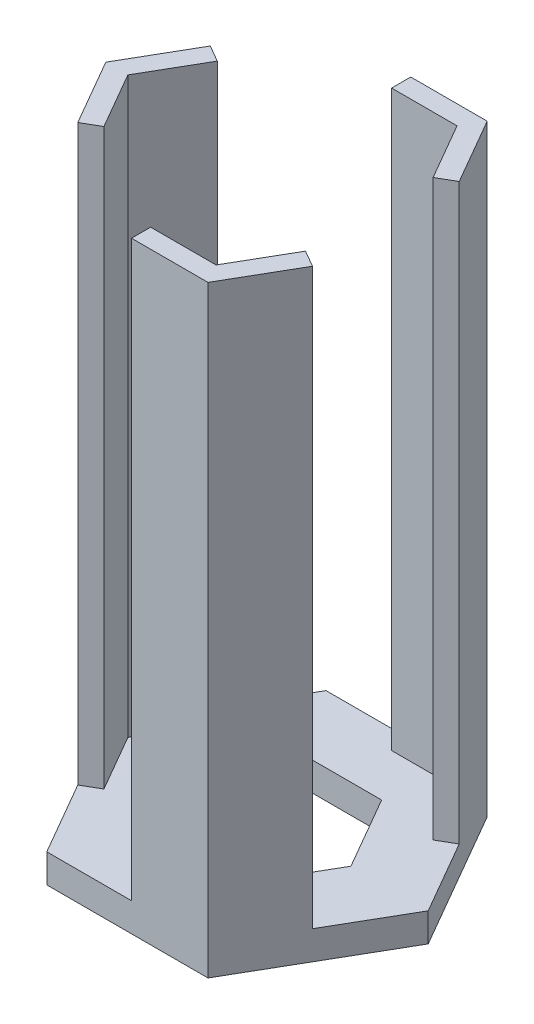
ISO-10303-21;
HEADER;
FILE_DESCRIPTION(('STEP AP214'),'2;1');
FILE_NAME('part.step','',(''),(''),'','','');
FILE_SCHEMA(('AUTOMOTIVE_DESIGN { 1 0 10303 214 1 1 1 1 }'));
ENDSEC;
DATA;
#1=APPLICATION_CONTEXT('core data for automotive mechanical design processes');
#2=APPLICATION_PROTOCOL_DEFINITION('international standard','automotive_design',2000,#1);
#3=PRODUCT_CONTEXT('',#1,'mechanical');
#4=PRODUCT('Part','Part','',(#3));
#5=PRODUCT_RELATED_PRODUCT_CATEGORY('part','',(#4));
#6=PRODUCT_DEFINITION_FORMATION('','',#4);
#7=PRODUCT_DEFINITION_CONTEXT('part definition',#1,'design');
#8=PRODUCT_DEFINITION('design','',#6,#7);
#9=PRODUCT_DEFINITION_SHAPE('','',#8);
#10=(LENGTH_UNIT() NAMED_UNIT(*) SI_UNIT(.MILLI.,.METRE.));
#11=(NAMED_UNIT(*) PLANE_ANGLE_UNIT() SI_UNIT($,.RADIAN.));
#12=(NAMED_UNIT(*) SI_UNIT($,.STERADIAN.) SOLID_ANGLE_UNIT());
#13=UNCERTAINTY_MEASURE_WITH_UNIT(LENGTH_MEASURE(1.E-05),#10,'distance_accuracy_value','');
#14=(GEOMETRIC_REPRESENTATION_CONTEXT(3) GLOBAL_UNCERTAINTY_ASSIGNED_CONTEXT((#13)) GLOBAL_UNIT_ASSIGNED_CONTEXT((#10,
#11,#12)) REPRESENTATION_CONTEXT('',''));
#15=CARTESIAN_POINT('',(0.,0.,0.));
#16=DIRECTION('',(0.,0.,1.));
#17=DIRECTION('',(1.,0.,0.));
#18=AXIS2_PLACEMENT_3D('',#15,#16,#17);
#19=CARTESIAN_POINT('',(0.,3.,0.));
#20=DIRECTION('',(0.,1.,0.));
#21=DIRECTION('',(0.,0.,1.));
#22=AXIS2_PLACEMENT_3D('',#19,#20,#21);
#23=PLANE('',#22);
#24=DIRECTION('',(0.499999999999995,0.,-0.866025403784441));
#25=VECTOR('',#24,1.);
#26=CARTESIAN_POINT('',(7.27461339178944,3.,12.5999999999999));
#27=LINE('',#26,#25);
#28=CARTESIAN_POINT('',(7.27461339178944,3.,12.5999999999999));
#29=VERTEX_POINT('',#28);
#30=CARTESIAN_POINT('',(10.6972631226001,3.,6.67179676972375));
#31=VERTEX_POINT('',#30);
#32=EDGE_CURVE('E415',#29,#31,#27,.T.);
#33=ORIENTED_EDGE('',*,*,#32,.T.);
#34=DIRECTION('',(0.866025403784439,0.,0.499999999999999));
#35=VECTOR('',#34,1.);
#36=CARTESIAN_POINT('',(-0.214656965083829,3.,0.371796769723731));
#37=LINE('',#36,#35);
#38=CARTESIAN_POINT('',(12.4293139301691,3.,7.67179676972377));
#39=VERTEX_POINT('',#38);
#40=EDGE_CURVE('E226',#31,#39,#37,.T.);
#41=ORIENTED_EDGE('',*,*,#40,.T.);
#42=DIRECTION('',(0.5,0.,-0.866025403784439));
#43=VECTOR('',#42,1.);
#44=CARTESIAN_POINT('',(12.6439708952529,3.,7.30000000000005));
#45=LINE('',#44,#43);
#46=CARTESIAN_POINT('',(16.8586278603372,3.,0.));
#47=VERTEX_POINT('',#46);
#48=EDGE_CURVE('E246',#39,#47,#45,.T.);
#49=ORIENTED_EDGE('',*,*,#48,.T.);
#50=DIRECTION('',(-0.5,0.,-0.866025403784439));
#51=VECTOR('',#50,1.);
#52=CARTESIAN_POINT('',(12.6439708952529,3.,-7.30000000000006));
#53=LINE('',#52,#51);
#54=CARTESIAN_POINT('',(12.4293139301682,3.,-7.67179676972537));
#55=VERTEX_POINT('',#54);
#56=EDGE_CURVE('E249',#47,#55,#53,.T.);
#57=ORIENTED_EDGE('',*,*,#56,.T.);
#58=DIRECTION('',(0.866025403784438,0.,-0.500000000000002));
#59=VECTOR('',#58,1.);
#60=CARTESIAN_POINT('',(-0.214656965084732,3.,-0.371796769725292));
#61=LINE('',#60,#59);
#62=CARTESIAN_POINT('',(10.6972631225992,3.,-6.67179676972531));
#63=VERTEX_POINT('',#62);
#64=EDGE_CURVE('E60',#63,#55,#61,.T.);
#65=ORIENTED_EDGE('',*,*,#64,.F.);
#66=DIRECTION('',(-0.500000000000001,0.,-0.866025403784438));
#67=VECTOR('',#66,1.);
#68=CARTESIAN_POINT('',(10.9119200876839,3.,-6.30000000000001));
#69=LINE('',#68,#67);
#70=CARTESIAN_POINT('',(7.27461339178926,3.,-12.6));
#71=VERTEX_POINT('',#70);
#72=EDGE_CURVE('E325',#63,#71,#69,.T.);
#73=ORIENTED_EDGE('',*,*,#72,.T.);
#74=DIRECTION('',(-1.,0.,0.));
#75=VECTOR('',#74,1.);
#76=CARTESIAN_POINT('',(7.27461339178926,3.,-12.6));
#77=LINE('',#76,#75);
#78=CARTESIAN_POINT('',(0.429313930168328,3.,-12.6));
#79=VERTEX_POINT('',#78);
#80=EDGE_CURVE('E417',#71,#79,#77,.T.);
#81=ORIENTED_EDGE('',*,*,#80,.T.);
#82=DIRECTION('',(0.,0.,-1.));
#83=VECTOR('',#82,1.);
#84=CARTESIAN_POINT('',(0.42931393016833,3.,0.));
#85=LINE('',#84,#83);
#86=CARTESIAN_POINT('',(0.429313930168327,3.,-14.6000000000001));
#87=VERTEX_POINT('',#86);
#88=EDGE_CURVE('E255',#79,#87,#85,.T.);
#89=ORIENTED_EDGE('',*,*,#88,.T.);
#90=DIRECTION('',(-1.,0.,0.));
#91=VECTOR('',#90,1.);
#92=CARTESIAN_POINT('',(0.,3.,-14.6000000000001));
#93=LINE('',#92,#91);
#94=CARTESIAN_POINT('',(-8.42931393016863,3.,-14.6000000000001));
#95=VERTEX_POINT('',#94);
#96=EDGE_CURVE('E258',#87,#95,#93,.T.);
#97=ORIENTED_EDGE('',*,*,#96,.T.);
#98=DIRECTION('',(-0.5,0.,0.866025403784439));
#99=VECTOR('',#98,1.);
#100=CARTESIAN_POINT('',(-12.6439708952529,3.,-7.30000000000007));
#101=LINE('',#100,#99);
#102=CARTESIAN_POINT('',(-12.8586278603372,3.,-6.92820323027556));
#103=VERTEX_POINT('',#102);
#104=EDGE_CURVE('E261',#95,#103,#101,.T.);
#105=ORIENTED_EDGE('',*,*,#104,.T.);
#106=DIRECTION('',(-0.866025403784439,0.,-0.5));
#107=VECTOR('',#106,1.);
#108=CARTESIAN_POINT('',(-0.21465696508428,3.,0.371796769724512));
#109=LINE('',#108,#107);
#110=CARTESIAN_POINT('',(-11.1265770527682,3.,-5.92820323027548));
#111=VERTEX_POINT('',#110);
#112=EDGE_CURVE('E264',#111,#103,#109,.T.);
#113=ORIENTED_EDGE('',*,*,#112,.F.);
#114=DIRECTION('',(-0.499999999999995,0.,0.866025403784442));
#115=VECTOR('',#114,1.);
#116=CARTESIAN_POINT('',(-10.911920087684,3.,-6.29999999999994));
#117=LINE('',#116,#115);
#118=CARTESIAN_POINT('',(-14.5492267835786,3.,1.01596707618923E-13));
#119=VERTEX_POINT('',#118);
#120=EDGE_CURVE('E358',#111,#119,#117,.T.);
#121=ORIENTED_EDGE('',*,*,#120,.T.);
#122=DIRECTION('',(0.500000000000007,0.,0.866025403784435));
#123=VECTOR('',#122,1.);
#124=CARTESIAN_POINT('',(-14.5492267835786,3.,1.01596707618923E-13));
#125=LINE('',#124,#123);
#126=CARTESIAN_POINT('',(-11.1265770527682,3.,5.92820323027548));
#127=VERTEX_POINT('',#126);
#128=EDGE_CURVE('E45',#119,#127,#125,.T.);
#129=ORIENTED_EDGE('',*,*,#128,.T.);
#130=DIRECTION('',(-0.866025403784439,0.,0.5));
#131=VECTOR('',#130,1.);
#132=CARTESIAN_POINT('',(-0.214656965084287,3.,-0.371796769724523));
#133=LINE('',#132,#131);
#134=CARTESIAN_POINT('',(-12.8586278603371,3.,6.92820323027551));
#135=VERTEX_POINT('',#134);
#136=EDGE_CURVE('E235',#127,#135,#133,.T.);
#137=ORIENTED_EDGE('',*,*,#136,.T.);
#138=DIRECTION('',(0.5,0.,0.866025403784439));
#139=VECTOR('',#138,1.);
#140=CARTESIAN_POINT('',(-12.6439708952529,3.,7.30000000000003));
#141=LINE('',#140,#139);
#142=CARTESIAN_POINT('',(-8.42931393016856,3.,14.6000000000001));
#143=VERTEX_POINT('',#142);
#144=EDGE_CURVE('E218',#135,#143,#141,.T.);
#145=ORIENTED_EDGE('',*,*,#144,.T.);
#146=DIRECTION('',(1.,0.,0.));
#147=VECTOR('',#146,1.);
#148=CARTESIAN_POINT('',(0.,3.,14.6000000000001));
#149=LINE('',#148,#147);
#150=CARTESIAN_POINT('',(0.429313930169251,3.,14.6000000000001));
#151=VERTEX_POINT('',#150);
#152=EDGE_CURVE('E227',#143,#151,#149,.T.);
#153=ORIENTED_EDGE('',*,*,#152,.T.);
#154=DIRECTION('',(0.,0.,1.));
#155=VECTOR('',#154,1.);
#156=CARTESIAN_POINT('',(0.429313930169239,3.,0.));
#157=LINE('',#156,#155);
#158=CARTESIAN_POINT('',(0.42931393016925,3.,12.6));
#159=VERTEX_POINT('',#158);
#160=EDGE_CURVE('E467',#159,#151,#157,.T.);
#161=ORIENTED_EDGE('',*,*,#160,.F.);
#162=DIRECTION('',(1.,0.,0.));
#163=VECTOR('',#162,1.);
#164=CARTESIAN_POINT('',(-7.27461339178917,3.,12.6000000000001));
#165=LINE('',#164,#163);
#166=EDGE_CURVE('E11',#159,#29,#165,.T.);
#167=ORIENTED_EDGE('',*,*,#166,.T.);
#168=EDGE_LOOP('',(#33,#41,#49,#57,#65,#73,#81,#89,#97,#105,#113,#121,#129,#137,#145,#153,#161,#167));
#169=FACE_BOUND('',#168,.T.);
#170=DIRECTION('',(0.5,0.,0.866025403784439));
#171=VECTOR('',#170,1.);
#172=CARTESIAN_POINT('',(-8.77572409168234,3.,0.));
#173=LINE('',#172,#171);
#174=CARTESIAN_POINT('',(-8.77572409168234,3.,0.));
#175=VERTEX_POINT('',#174);
#176=CARTESIAN_POINT('',(-4.38786204584117,3.,7.60000000000002));
#177=VERTEX_POINT('',#176);
#178=EDGE_CURVE('E373',#175,#177,#173,.T.);
#179=ORIENTED_EDGE('',*,*,#178,.F.);
#180=DIRECTION('',(-0.5,0.,0.866025403784439));
#181=VECTOR('',#180,1.);
#182=CARTESIAN_POINT('',(-4.38786204584117,3.,-7.60000000000003));
#183=LINE('',#182,#181);
#184=CARTESIAN_POINT('',(-4.38786204584117,3.,-7.60000000000003));
#185=VERTEX_POINT('',#184);
#186=EDGE_CURVE('E371',#185,#175,#183,.T.);
#187=ORIENTED_EDGE('',*,*,#186,.F.);
#188=DIRECTION('',(-1.,0.,0.));
#189=VECTOR('',#188,1.);
#190=CARTESIAN_POINT('',(4.38786204584117,3.,-7.60000000000003));
#191=LINE('',#190,#189);
#192=CARTESIAN_POINT('',(4.38786204584117,3.,-7.60000000000003));
#193=VERTEX_POINT('',#192);
#194=EDGE_CURVE('E383',#193,#185,#191,.T.);
#195=ORIENTED_EDGE('',*,*,#194,.F.);
#196=DIRECTION('',(-0.5,0.,-0.866025403784439));
#197=VECTOR('',#196,1.);
#198=CARTESIAN_POINT('',(8.77572409168234,3.,0.));
#199=LINE('',#198,#197);
#200=CARTESIAN_POINT('',(8.77572409168234,3.,0.));
#201=VERTEX_POINT('',#200);
#202=EDGE_CURVE('E380',#201,#193,#199,.T.);
#203=ORIENTED_EDGE('',*,*,#202,.F.);
#204=DIRECTION('',(0.5,0.,-0.866025403784439));
#205=VECTOR('',#204,1.);
#206=CARTESIAN_POINT('',(4.38786204584117,3.,7.60000000000003));
#207=LINE('',#206,#205);
#208=CARTESIAN_POINT('',(4.38786204584117,3.,7.60000000000003));
#209=VERTEX_POINT('',#208);
#210=EDGE_CURVE('E378',#209,#201,#207,.T.);
#211=ORIENTED_EDGE('',*,*,#210,.F.);
#212=DIRECTION('',(1.,0.,0.));
#213=VECTOR('',#212,1.);
#214=CARTESIAN_POINT('',(-4.38786204584117,3.,7.60000000000002));
#215=LINE('',#214,#213);
#216=EDGE_CURVE('E376',#177,#209,#215,.T.);
#217=ORIENTED_EDGE('',*,*,#216,.F.);
#218=EDGE_LOOP('',(#179,#187,#195,#203,#211,#217));
#219=FACE_BOUND('',#218,.T.);
#220=ADVANCED_FACE('F37',(#169,#219),#23,.T.);
#221=CARTESIAN_POINT('',(0.,0.,0.));
#222=DIRECTION('',(0.,1.,0.));
#223=DIRECTION('',(0.,0.,1.));
#224=AXIS2_PLACEMENT_3D('',#221,#222,#223);
#225=PLANE('',#224);
#226=DIRECTION('',(0.5,0.,0.866025403784439));
#227=VECTOR('',#226,1.);
#228=CARTESIAN_POINT('',(12.6439708952529,0.,-7.30000000000006));
#229=LINE('',#228,#227);
#230=CARTESIAN_POINT('',(8.42931393016859,0.,-14.6000000000001));
#231=VERTEX_POINT('',#230);
#232=CARTESIAN_POINT('',(16.8586278603372,0.,0.));
#233=VERTEX_POINT('',#232);
#234=EDGE_CURVE('E320',#231,#233,#229,.T.);
#235=ORIENTED_EDGE('',*,*,#234,.T.);
#236=DIRECTION('',(-0.5,0.,0.866025403784439));
#237=VECTOR('',#236,1.);
#238=CARTESIAN_POINT('',(12.6439708952529,0.,7.30000000000005));
#239=LINE('',#238,#237);
#240=CARTESIAN_POINT('',(8.4293139301686,0.,14.6000000000001));
#241=VERTEX_POINT('',#240);
#242=EDGE_CURVE('E289',#233,#241,#239,.T.);
#243=ORIENTED_EDGE('',*,*,#242,.T.);
#244=DIRECTION('',(-1.,0.,0.));
#245=VECTOR('',#244,1.);
#246=CARTESIAN_POINT('',(0.,0.,14.6000000000001));
#247=LINE('',#246,#245);
#248=CARTESIAN_POINT('',(-8.42931393016856,0.,14.6000000000001));
#249=VERTEX_POINT('',#248);
#250=EDGE_CURVE('E287',#241,#249,#247,.T.);
#251=ORIENTED_EDGE('',*,*,#250,.T.);
#252=DIRECTION('',(-0.5,0.,-0.866025403784439));
#253=VECTOR('',#252,1.);
#254=CARTESIAN_POINT('',(-12.6439708952529,0.,7.30000000000003));
#255=LINE('',#254,#253);
#256=CARTESIAN_POINT('',(-16.8586278603372,0.,0.));
#257=VERTEX_POINT('',#256);
#258=EDGE_CURVE('E221',#249,#257,#255,.T.);
#259=ORIENTED_EDGE('',*,*,#258,.T.);
#260=DIRECTION('',(0.5,0.,-0.866025403784439));
#261=VECTOR('',#260,1.);
#262=CARTESIAN_POINT('',(-12.6439708952529,0.,-7.30000000000007));
#263=LINE('',#262,#261);
#264=CARTESIAN_POINT('',(-8.42931393016863,0.,-14.6000000000001));
#265=VERTEX_POINT('',#264);
#266=EDGE_CURVE('E355',#257,#265,#263,.T.);
#267=ORIENTED_EDGE('',*,*,#266,.T.);
#268=DIRECTION('',(1.,0.,0.));
#269=VECTOR('',#268,1.);
#270=CARTESIAN_POINT('',(0.,0.,-14.6000000000001));
#271=LINE('',#270,#269);
#272=EDGE_CURVE('E322',#265,#231,#271,.T.);
#273=ORIENTED_EDGE('',*,*,#272,.T.);
#274=EDGE_LOOP('',(#235,#243,#251,#259,#267,#273));
#275=FACE_BOUND('',#274,.T.);
#276=DIRECTION('',(-0.5,0.,0.866025403784439));
#277=VECTOR('',#276,1.);
#278=CARTESIAN_POINT('',(-4.38786204584117,0.,-7.60000000000003));
#279=LINE('',#278,#277);
#280=CARTESIAN_POINT('',(-4.38786204584117,0.,-7.60000000000003));
#281=VERTEX_POINT('',#280);
#282=CARTESIAN_POINT('',(-8.77572409168234,0.,0.));
#283=VERTEX_POINT('',#282);
#284=EDGE_CURVE('E370',#281,#283,#279,.T.);
#285=ORIENTED_EDGE('',*,*,#284,.T.);
#286=DIRECTION('',(0.5,0.,0.866025403784439));
#287=VECTOR('',#286,1.);
#288=CARTESIAN_POINT('',(-8.77572409168234,0.,0.));
#289=LINE('',#288,#287);
#290=CARTESIAN_POINT('',(-4.38786204584117,0.,7.60000000000002));
#291=VERTEX_POINT('',#290);
#292=EDGE_CURVE('E388',#283,#291,#289,.T.);
#293=ORIENTED_EDGE('',*,*,#292,.T.);
#294=DIRECTION('',(1.,0.,0.));
#295=VECTOR('',#294,1.);
#296=CARTESIAN_POINT('',(-4.38786204584117,0.,7.60000000000002));
#297=LINE('',#296,#295);
#298=CARTESIAN_POINT('',(4.38786204584117,0.,7.60000000000003));
#299=VERTEX_POINT('',#298);
#300=EDGE_CURVE('E391',#291,#299,#297,.T.);
#301=ORIENTED_EDGE('',*,*,#300,.T.);
#302=DIRECTION('',(0.5,0.,-0.866025403784439));
#303=VECTOR('',#302,1.);
#304=CARTESIAN_POINT('',(4.38786204584117,0.,7.60000000000003));
#305=LINE('',#304,#303);
#306=CARTESIAN_POINT('',(8.77572409168234,0.,0.));
#307=VERTEX_POINT('',#306);
#308=EDGE_CURVE('E394',#299,#307,#305,.T.);
#309=ORIENTED_EDGE('',*,*,#308,.T.);
#310=DIRECTION('',(-0.5,0.,-0.866025403784439));
#311=VECTOR('',#310,1.);
#312=CARTESIAN_POINT('',(8.77572409168234,0.,0.));
#313=LINE('',#312,#311);
#314=CARTESIAN_POINT('',(4.38786204584117,0.,-7.60000000000003));
#315=VERTEX_POINT('',#314);
#316=EDGE_CURVE('E397',#307,#315,#313,.T.);
#317=ORIENTED_EDGE('',*,*,#316,.T.);
#318=DIRECTION('',(-1.,0.,0.));
#319=VECTOR('',#318,1.);
#320=CARTESIAN_POINT('',(4.38786204584117,0.,-7.60000000000003));
#321=LINE('',#320,#319);
#322=EDGE_CURVE('E374',#315,#281,#321,.T.);
#323=ORIENTED_EDGE('',*,*,#322,.T.);
#324=EDGE_LOOP('',(#285,#293,#301,#309,#317,#323));
#325=FACE_BOUND('',#324,.T.);
#326=ADVANCED_FACE('F39',(#275,#325),#225,.F.);
#327=CARTESIAN_POINT('',(-4.38786204584117,3.,-7.60000000000003));
#328=DIRECTION('',(0.866025403784439,0.,0.5));
#329=DIRECTION('',(0.5,0.,-0.866025403784439));
#330=AXIS2_PLACEMENT_3D('',#327,#328,#329);
#331=PLANE('',#330);
#332=ORIENTED_EDGE('',*,*,#284,.F.);
#333=DIRECTION('',(0.,-1.,0.));
#334=VECTOR('',#333,1.);
#335=CARTESIAN_POINT('',(-4.38786204584117,3.,-7.60000000000003));
#336=LINE('',#335,#334);
#337=EDGE_CURVE('E385',#185,#281,#336,.T.);
#338=ORIENTED_EDGE('',*,*,#337,.F.);
#339=ORIENTED_EDGE('',*,*,#186,.T.);
#340=DIRECTION('',(0.,-1.,0.));
#341=VECTOR('',#340,1.);
#342=CARTESIAN_POINT('',(-8.77572409168234,3.,0.));
#343=LINE('',#342,#341);
#344=EDGE_CURVE('E412',#175,#283,#343,.T.);
#345=ORIENTED_EDGE('',*,*,#344,.T.);
#346=EDGE_LOOP('',(#332,#338,#339,#345));
#347=FACE_BOUND('',#346,.T.);
#348=ADVANCED_FACE('F489',(#347),#331,.T.);
#349=CARTESIAN_POINT('',(-8.77572409168234,3.,0.));
#350=DIRECTION('',(0.866025403784438,0.,-0.5));
#351=DIRECTION('',(-0.5,0.,-0.866025403784439));
#352=AXIS2_PLACEMENT_3D('',#349,#350,#351);
#353=PLANE('',#352);
#354=ORIENTED_EDGE('',*,*,#292,.F.);
#355=ORIENTED_EDGE('',*,*,#344,.F.);
#356=ORIENTED_EDGE('',*,*,#178,.T.);
#357=DIRECTION('',(0.,-1.,0.));
#358=VECTOR('',#357,1.);
#359=CARTESIAN_POINT('',(-4.38786204584117,3.,7.60000000000002));
#360=LINE('',#359,#358);
#361=EDGE_CURVE('E410',#177,#291,#360,.T.);
#362=ORIENTED_EDGE('',*,*,#361,.T.);
#363=EDGE_LOOP('',(#354,#355,#356,#362));
#364=FACE_BOUND('',#363,.T.);
#365=ADVANCED_FACE('F493',(#364),#353,.T.);
#366=CARTESIAN_POINT('',(-4.38786204584117,3.,7.60000000000002));
#367=DIRECTION('',(0.,0.,-1.));
#368=DIRECTION('',(-1.,0.,0.));
#369=AXIS2_PLACEMENT_3D('',#366,#367,#368);
#370=PLANE('',#369);
#371=ORIENTED_EDGE('',*,*,#300,.F.);
#372=ORIENTED_EDGE('',*,*,#361,.F.);
#373=ORIENTED_EDGE('',*,*,#216,.T.);
#374=DIRECTION('',(0.,-1.,0.));
#375=VECTOR('',#374,1.);
#376=CARTESIAN_POINT('',(4.38786204584117,3.,7.60000000000003));
#377=LINE('',#376,#375);
#378=EDGE_CURVE('E408',#209,#299,#377,.T.);
#379=ORIENTED_EDGE('',*,*,#378,.T.);
#380=EDGE_LOOP('',(#371,#372,#373,#379));
#381=FACE_BOUND('',#380,.T.);
#382=ADVANCED_FACE('F497',(#381),#370,.T.);
#383=CARTESIAN_POINT('',(4.38786204584117,3.,7.60000000000003));
#384=DIRECTION('',(-0.866025403784439,0.,-0.5));
#385=DIRECTION('',(-0.5,0.,0.866025403784439));
#386=AXIS2_PLACEMENT_3D('',#383,#384,#385);
#387=PLANE('',#386);
#388=ORIENTED_EDGE('',*,*,#308,.F.);
#389=ORIENTED_EDGE('',*,*,#378,.F.);
#390=ORIENTED_EDGE('',*,*,#210,.T.);
#391=DIRECTION('',(0.,-1.,0.));
#392=VECTOR('',#391,1.);
#393=CARTESIAN_POINT('',(8.77572409168234,3.,0.));
#394=LINE('',#393,#392);
#395=EDGE_CURVE('E406',#201,#307,#394,.T.);
#396=ORIENTED_EDGE('',*,*,#395,.T.);
#397=EDGE_LOOP('',(#388,#389,#390,#396));
#398=FACE_BOUND('',#397,.T.);
#399=ADVANCED_FACE('F501',(#398),#387,.T.);
#400=CARTESIAN_POINT('',(8.77572409168234,3.,0.));
#401=DIRECTION('',(-0.866025403784439,0.,0.5));
#402=DIRECTION('',(0.5,0.,0.866025403784439));
#403=AXIS2_PLACEMENT_3D('',#400,#401,#402);
#404=PLANE('',#403);
#405=ORIENTED_EDGE('',*,*,#316,.F.);
#406=ORIENTED_EDGE('',*,*,#395,.F.);
#407=ORIENTED_EDGE('',*,*,#202,.T.);
#408=DIRECTION('',(0.,-1.,0.));
#409=VECTOR('',#408,1.);
#410=CARTESIAN_POINT('',(4.38786204584117,3.,-7.60000000000003));
#411=LINE('',#410,#409);
#412=EDGE_CURVE('E404',#193,#315,#411,.T.);
#413=ORIENTED_EDGE('',*,*,#412,.T.);
#414=EDGE_LOOP('',(#405,#406,#407,#413));
#415=FACE_BOUND('',#414,.T.);
#416=ADVANCED_FACE('F505',(#415),#404,.T.);
#417=CARTESIAN_POINT('',(4.38786204584117,3.,-7.60000000000003));
#418=DIRECTION('',(0.,0.,1.));
#419=DIRECTION('',(1.,0.,0.));
#420=AXIS2_PLACEMENT_3D('',#417,#418,#419);
#421=PLANE('',#420);
#422=ORIENTED_EDGE('',*,*,#322,.F.);
#423=ORIENTED_EDGE('',*,*,#412,.F.);
#424=ORIENTED_EDGE('',*,*,#194,.T.);
#425=ORIENTED_EDGE('',*,*,#337,.T.);
#426=EDGE_LOOP('',(#422,#423,#424,#425));
#427=FACE_BOUND('',#426,.T.);
#428=ADVANCED_FACE('F509',(#427),#421,.T.);
#429=CARTESIAN_POINT('',(-10.9119200876839,-14.9952127847708,6.30000000000009));
#430=DIRECTION('',(-0.866025403784435,0.,0.500000000000007));
#431=DIRECTION('',(0.500000000000007,0.,0.866025403784435));
#432=AXIS2_PLACEMENT_3D('',#429,#430,#431);
#433=PLANE('',#432);
#434=ORIENTED_EDGE('',*,*,#128,.F.);
#435=DIRECTION('',(0.,1.,0.));
#436=VECTOR('',#435,1.);
#437=CARTESIAN_POINT('',(-14.5492267835786,-14.9952127847708,1.01481323344643E-13));
#438=LINE('',#437,#436);
#439=CARTESIAN_POINT('',(-14.5492267835786,63.,1.01481323344643E-13));
#440=VERTEX_POINT('',#439);
#441=EDGE_CURVE('E366',#119,#440,#438,.T.);
#442=ORIENTED_EDGE('',*,*,#441,.T.);
#443=DIRECTION('',(0.500000000000007,0.,0.866025403784435));
#444=VECTOR('',#443,1.);
#445=CARTESIAN_POINT('',(-10.9119200876839,63.,6.30000000000009));
#446=LINE('',#445,#444);
#447=CARTESIAN_POINT('',(-11.1265770527682,63.,5.92820323027548));
#448=VERTEX_POINT('',#447);
#449=EDGE_CURVE('E339',#440,#448,#446,.T.);
#450=ORIENTED_EDGE('',*,*,#449,.T.);
#451=DIRECTION('',(0.,1.,0.));
#452=VECTOR('',#451,1.);
#453=CARTESIAN_POINT('',(-11.1265770527682,-14.9952127847708,5.92820323027548));
#454=LINE('',#453,#452);
#455=EDGE_CURVE('E354',#127,#448,#454,.T.);
#456=ORIENTED_EDGE('',*,*,#455,.F.);
#457=EDGE_LOOP('',(#434,#442,#450,#456));
#458=FACE_BOUND('',#457,.T.);
#459=ADVANCED_FACE('F424',(#458),#433,.F.);
#460=CARTESIAN_POINT('',(-10.911920087684,-14.9952127847708,-6.29999999999994));
#461=DIRECTION('',(-0.866025403784442,0.,-0.499999999999995));
#462=DIRECTION('',(-0.499999999999995,0.,0.866025403784442));
#463=AXIS2_PLACEMENT_3D('',#460,#461,#462);
#464=PLANE('',#463);
#465=ORIENTED_EDGE('',*,*,#120,.F.);
#466=DIRECTION('',(0.,1.,0.));
#467=VECTOR('',#466,1.);
#468=CARTESIAN_POINT('',(-11.1265770527682,-14.9952127847708,-5.92820323027548));
#469=LINE('',#468,#467);
#470=CARTESIAN_POINT('',(-11.1265770527682,63.,-5.92820323027548));
#471=VERTEX_POINT('',#470);
#472=EDGE_CURVE('E364',#111,#471,#469,.T.);
#473=ORIENTED_EDGE('',*,*,#472,.T.);
#474=DIRECTION('',(-0.499999999999995,0.,0.866025403784442));
#475=VECTOR('',#474,1.);
#476=CARTESIAN_POINT('',(-10.911920087684,63.,-6.29999999999994));
#477=LINE('',#476,#475);
#478=EDGE_CURVE('E342',#471,#440,#477,.T.);
#479=ORIENTED_EDGE('',*,*,#478,.T.);
#480=ORIENTED_EDGE('',*,*,#441,.F.);
#481=EDGE_LOOP('',(#465,#473,#479,#480));
#482=FACE_BOUND('',#481,.T.);
#483=ADVANCED_FACE('F518',(#482),#464,.F.);
#484=CARTESIAN_POINT('',(-0.21465696508428,-14.9952127847708,0.371796769724512));
#485=DIRECTION('',(0.499999999999999,0.,-0.866025403784439));
#486=DIRECTION('',(-0.866025403784439,0.,-0.5));
#487=AXIS2_PLACEMENT_3D('',#484,#485,#486);
#488=PLANE('',#487);
#489=ORIENTED_EDGE('',*,*,#112,.T.);
#490=DIRECTION('',(0.,1.,0.));
#491=VECTOR('',#490,1.);
#492=CARTESIAN_POINT('',(-12.8586278603372,-14.9952127847708,-6.92820323027556));
#493=LINE('',#492,#491);
#494=CARTESIAN_POINT('',(-12.8586278603372,63.,-6.92820323027556));
#495=VERTEX_POINT('',#494);
#496=EDGE_CURVE('E362',#103,#495,#493,.T.);
#497=ORIENTED_EDGE('',*,*,#496,.T.);
#498=DIRECTION('',(-0.866025403784439,0.,-0.5));
#499=VECTOR('',#498,1.);
#500=CARTESIAN_POINT('',(-0.21465696508428,63.,0.371796769724512));
#501=LINE('',#500,#499);
#502=EDGE_CURVE('E345',#471,#495,#501,.T.);
#503=ORIENTED_EDGE('',*,*,#502,.F.);
#504=ORIENTED_EDGE('',*,*,#472,.F.);
#505=EDGE_LOOP('',(#489,#497,#503,#504));
#506=FACE_BOUND('',#505,.T.);
#507=ADVANCED_FACE('F521',(#506),#488,.T.);
#508=CARTESIAN_POINT('',(-12.6439708952529,-14.9952127847708,-7.30000000000007));
#509=DIRECTION('',(-0.866025403784439,0.,-0.5));
#510=DIRECTION('',(-0.5,0.,0.866025403784439));
#511=AXIS2_PLACEMENT_3D('',#508,#509,#510);
#512=PLANE('',#511);
#513=ORIENTED_EDGE('',*,*,#266,.F.);
#514=DIRECTION('',(0.,1.,0.));
#515=VECTOR('',#514,1.);
#516=CARTESIAN_POINT('',(-16.8586278603372,-14.9952127847708,0.));
#517=LINE('',#516,#515);
#518=CARTESIAN_POINT('',(-16.8586278603372,63.,0.));
#519=VERTEX_POINT('',#518);
#520=EDGE_CURVE('E360',#257,#519,#517,.T.);
#521=ORIENTED_EDGE('',*,*,#520,.T.);
#522=DIRECTION('',(-0.5,0.,0.866025403784439));
#523=VECTOR('',#522,1.);
#524=CARTESIAN_POINT('',(-12.6439708952529,63.,-7.30000000000007));
#525=LINE('',#524,#523);
#526=EDGE_CURVE('E348',#495,#519,#525,.T.);
#527=ORIENTED_EDGE('',*,*,#526,.F.);
#528=ORIENTED_EDGE('',*,*,#496,.F.);
#529=ORIENTED_EDGE('',*,*,#104,.F.);
#530=DIRECTION('',(0.,1.,0.));
#531=VECTOR('',#530,1.);
#532=CARTESIAN_POINT('',(-8.42931393016863,-16.5344572978755,-14.6000000000001));
#533=LINE('',#532,#531);
#534=EDGE_CURVE('E266',#265,#95,#533,.T.);
#535=ORIENTED_EDGE('',*,*,#534,.F.);
#536=EDGE_LOOP('',(#513,#521,#527,#528,#529,#535));
#537=FACE_BOUND('',#536,.T.);
#538=ADVANCED_FACE('F436',(#537),#512,.T.);
#539=CARTESIAN_POINT('',(-12.6439708952529,-14.9952127847708,7.30000000000003));
#540=DIRECTION('',(-0.866025403784439,0.,0.5));
#541=DIRECTION('',(0.5,0.,0.866025403784439));
#542=AXIS2_PLACEMENT_3D('',#539,#540,#541);
#543=PLANE('',#542);
#544=ORIENTED_EDGE('',*,*,#258,.F.);
#545=DIRECTION('',(0.,1.,0.));
#546=VECTOR('',#545,1.);
#547=CARTESIAN_POINT('',(-8.42931393016856,-16.5344572978755,14.6000000000001));
#548=LINE('',#547,#546);
#549=EDGE_CURVE('E215',#249,#143,#548,.T.);
#550=ORIENTED_EDGE('',*,*,#549,.T.);
#551=ORIENTED_EDGE('',*,*,#144,.F.);
#552=DIRECTION('',(0.,1.,0.));
#553=VECTOR('',#552,1.);
#554=CARTESIAN_POINT('',(-12.8586278603371,-14.9952127847708,6.92820323027551));
#555=LINE('',#554,#553);
#556=CARTESIAN_POINT('',(-12.8586278603371,63.,6.92820323027551));
#557=VERTEX_POINT('',#556);
#558=EDGE_CURVE('E52',#135,#557,#555,.T.);
#559=ORIENTED_EDGE('',*,*,#558,.T.);
#560=DIRECTION('',(0.5,0.,0.866025403784439));
#561=VECTOR('',#560,1.);
#562=CARTESIAN_POINT('',(-12.6439708952529,63.,7.30000000000003));
#563=LINE('',#562,#561);
#564=EDGE_CURVE('E351',#519,#557,#563,.T.);
#565=ORIENTED_EDGE('',*,*,#564,.F.);
#566=ORIENTED_EDGE('',*,*,#520,.F.);
#567=EDGE_LOOP('',(#544,#550,#551,#559,#565,#566));
#568=FACE_BOUND('',#567,.T.);
#569=ADVANCED_FACE('F217',(#568),#543,.T.);
#570=CARTESIAN_POINT('',(-0.214656965084287,-14.9952127847708,-0.371796769724523));
#571=DIRECTION('',(-0.5,0.,-0.866025403784439));
#572=DIRECTION('',(-0.866025403784439,0.,0.5));
#573=AXIS2_PLACEMENT_3D('',#570,#571,#572);
#574=PLANE('',#573);
#575=ORIENTED_EDGE('',*,*,#558,.F.);
#576=ORIENTED_EDGE('',*,*,#136,.F.);
#577=ORIENTED_EDGE('',*,*,#455,.T.);
#578=DIRECTION('',(-0.866025403784439,0.,0.5));
#579=VECTOR('',#578,1.);
#580=CARTESIAN_POINT('',(-0.214656965084287,63.,-0.371796769724523));
#581=LINE('',#580,#579);
#582=EDGE_CURVE('E337',#448,#557,#581,.T.);
#583=ORIENTED_EDGE('',*,*,#582,.T.);
#584=EDGE_LOOP('',(#575,#576,#577,#583));
#585=FACE_BOUND('',#584,.T.);
#586=ADVANCED_FACE('F427',(#585),#574,.F.);
#587=CARTESIAN_POINT('',(0.,63.,0.));
#588=DIRECTION('',(0.,1.,0.));
#589=DIRECTION('',(0.,0.,1.));
#590=AXIS2_PLACEMENT_3D('',#587,#588,#589);
#591=PLANE('',#590);
#592=ORIENTED_EDGE('',*,*,#582,.F.);
#593=ORIENTED_EDGE('',*,*,#449,.F.);
#594=ORIENTED_EDGE('',*,*,#478,.F.);
#595=ORIENTED_EDGE('',*,*,#502,.T.);
#596=ORIENTED_EDGE('',*,*,#526,.T.);
#597=ORIENTED_EDGE('',*,*,#564,.T.);
#598=EDGE_LOOP('',(#592,#593,#594,#595,#596,#597));
#599=FACE_BOUND('',#598,.T.);
#600=ADVANCED_FACE('F429',(#599),#591,.T.);
#601=CARTESIAN_POINT('',(0.,-14.9952127847708,-12.6));
#602=DIRECTION('',(0.,0.,-1.));
#603=DIRECTION('',(-1.,0.,0.));
#604=AXIS2_PLACEMENT_3D('',#601,#602,#603);
#605=PLANE('',#604);
#606=ORIENTED_EDGE('',*,*,#80,.F.);
#607=DIRECTION('',(0.,1.,0.));
#608=VECTOR('',#607,1.);
#609=CARTESIAN_POINT('',(7.27461339178926,-14.9952127847708,-12.6));
#610=LINE('',#609,#608);
#611=CARTESIAN_POINT('',(7.27461339178926,63.,-12.6));
#612=VERTEX_POINT('',#611);
#613=EDGE_CURVE('E333',#71,#612,#610,.T.);
#614=ORIENTED_EDGE('',*,*,#613,.T.);
#615=DIRECTION('',(-1.,0.,0.));
#616=VECTOR('',#615,1.);
#617=CARTESIAN_POINT('',(0.,63.,-12.6));
#618=LINE('',#617,#616);
#619=CARTESIAN_POINT('',(0.429313930168327,63.,-12.6));
#620=VERTEX_POINT('',#619);
#621=EDGE_CURVE('E304',#612,#620,#618,.T.);
#622=ORIENTED_EDGE('',*,*,#621,.T.);
#623=DIRECTION('',(0.,1.,0.));
#624=VECTOR('',#623,1.);
#625=CARTESIAN_POINT('',(0.429313930168327,-14.9952127847708,-12.6));
#626=LINE('',#625,#624);
#627=EDGE_CURVE('E319',#79,#620,#626,.T.);
#628=ORIENTED_EDGE('',*,*,#627,.F.);
#629=EDGE_LOOP('',(#606,#614,#622,#628));
#630=FACE_BOUND('',#629,.T.);
#631=ADVANCED_FACE('F532',(#630),#605,.F.);
#632=CARTESIAN_POINT('',(10.9119200876839,-14.9952127847708,-6.30000000000001));
#633=DIRECTION('',(0.866025403784438,0.,-0.500000000000001));
#634=DIRECTION('',(-0.500000000000001,0.,-0.866025403784438));
#635=AXIS2_PLACEMENT_3D('',#632,#633,#634);
#636=PLANE('',#635);
#637=ORIENTED_EDGE('',*,*,#72,.F.);
#638=DIRECTION('',(0.,1.,0.));
#639=VECTOR('',#638,1.);
#640=CARTESIAN_POINT('',(10.6972631225992,-14.9952127847708,-6.67179676972531));
#641=LINE('',#640,#639);
#642=CARTESIAN_POINT('',(10.6972631225992,63.,-6.67179676972531));
#643=VERTEX_POINT('',#642);
#644=EDGE_CURVE('E331',#63,#643,#641,.T.);
#645=ORIENTED_EDGE('',*,*,#644,.T.);
#646=DIRECTION('',(-0.500000000000001,0.,-0.866025403784438));
#647=VECTOR('',#646,1.);
#648=CARTESIAN_POINT('',(10.9119200876839,63.,-6.30000000000001));
#649=LINE('',#648,#647);
#650=EDGE_CURVE('E307',#643,#612,#649,.T.);
#651=ORIENTED_EDGE('',*,*,#650,.T.);
#652=ORIENTED_EDGE('',*,*,#613,.F.);
#653=EDGE_LOOP('',(#637,#645,#651,#652));
#654=FACE_BOUND('',#653,.T.);
#655=ADVANCED_FACE('F539',(#654),#636,.F.);
#656=CARTESIAN_POINT('',(-0.214656965084732,-14.9952127847708,-0.371796769725292));
#657=DIRECTION('',(0.500000000000002,0.,0.866025403784438));
#658=DIRECTION('',(0.866025403784438,0.,-0.500000000000002));
#659=AXIS2_PLACEMENT_3D('',#656,#657,#658);
#660=PLANE('',#659);
#661=ORIENTED_EDGE('',*,*,#64,.T.);
#662=DIRECTION('',(0.,1.,0.));
#663=VECTOR('',#662,1.);
#664=CARTESIAN_POINT('',(12.4293139301682,-14.9952127847708,-7.67179676972537));
#665=LINE('',#664,#663);
#666=CARTESIAN_POINT('',(12.4293139301682,63.,-7.67179676972537));
#667=VERTEX_POINT('',#666);
#668=EDGE_CURVE('E329',#55,#667,#665,.T.);
#669=ORIENTED_EDGE('',*,*,#668,.T.);
#670=DIRECTION('',(0.866025403784438,0.,-0.500000000000002));
#671=VECTOR('',#670,1.);
#672=CARTESIAN_POINT('',(-0.214656965084732,63.,-0.371796769725292));
#673=LINE('',#672,#671);
#674=EDGE_CURVE('E310',#643,#667,#673,.T.);
#675=ORIENTED_EDGE('',*,*,#674,.F.);
#676=ORIENTED_EDGE('',*,*,#644,.F.);
#677=EDGE_LOOP('',(#661,#669,#675,#676));
#678=FACE_BOUND('',#677,.T.);
#679=ADVANCED_FACE('F543',(#678),#660,.T.);
#680=CARTESIAN_POINT('',(12.6439708952529,-14.9952127847708,-7.30000000000006));
#681=DIRECTION('',(0.866025403784439,0.,-0.5));
#682=DIRECTION('',(-0.5,0.,-0.866025403784439));
#683=AXIS2_PLACEMENT_3D('',#680,#681,#682);
#684=PLANE('',#683);
#685=ORIENTED_EDGE('',*,*,#234,.F.);
#686=DIRECTION('',(0.,1.,0.));
#687=VECTOR('',#686,1.);
#688=CARTESIAN_POINT('',(8.42931393016859,-14.9952127847708,-14.6000000000001));
#689=LINE('',#688,#687);
#690=CARTESIAN_POINT('',(8.42931393016859,63.,-14.6000000000001));
#691=VERTEX_POINT('',#690);
#692=EDGE_CURVE('E327',#231,#691,#689,.T.);
#693=ORIENTED_EDGE('',*,*,#692,.T.);
#694=DIRECTION('',(-0.5,0.,-0.866025403784439));
#695=VECTOR('',#694,1.);
#696=CARTESIAN_POINT('',(12.6439708952529,63.,-7.30000000000006));
#697=LINE('',#696,#695);
#698=EDGE_CURVE('E313',#667,#691,#697,.T.);
#699=ORIENTED_EDGE('',*,*,#698,.F.);
#700=ORIENTED_EDGE('',*,*,#668,.F.);
#701=ORIENTED_EDGE('',*,*,#56,.F.);
#702=DIRECTION('',(0.,1.,0.));
#703=VECTOR('',#702,1.);
#704=CARTESIAN_POINT('',(16.8586278603372,-16.5344572978755,0.));
#705=LINE('',#704,#703);
#706=EDGE_CURVE('E253',#233,#47,#705,.T.);
#707=ORIENTED_EDGE('',*,*,#706,.F.);
#708=EDGE_LOOP('',(#685,#693,#699,#700,#701,#707));
#709=FACE_BOUND('',#708,.T.);
#710=ADVANCED_FACE('F450',(#709),#684,.T.);
#711=CARTESIAN_POINT('',(0.,-14.9952127847708,-14.6000000000001));
#712=DIRECTION('',(0.,0.,-1.));
#713=DIRECTION('',(-1.,0.,0.));
#714=AXIS2_PLACEMENT_3D('',#711,#712,#713);
#715=PLANE('',#714);
#716=ORIENTED_EDGE('',*,*,#272,.F.);
#717=ORIENTED_EDGE('',*,*,#534,.T.);
#718=ORIENTED_EDGE('',*,*,#96,.F.);
#719=DIRECTION('',(0.,1.,0.));
#720=VECTOR('',#719,1.);
#721=CARTESIAN_POINT('',(0.429313930168327,-14.9952127847708,-14.6000000000001));
#722=LINE('',#721,#720);
#723=CARTESIAN_POINT('',(0.429313930168327,63.,-14.6000000000001));
#724=VERTEX_POINT('',#723);
#725=EDGE_CURVE('E323',#87,#724,#722,.T.);
#726=ORIENTED_EDGE('',*,*,#725,.T.);
#727=DIRECTION('',(-1.,0.,0.));
#728=VECTOR('',#727,1.);
#729=CARTESIAN_POINT('',(0.,63.,-14.6000000000001));
#730=LINE('',#729,#728);
#731=EDGE_CURVE('E316',#691,#724,#730,.T.);
#732=ORIENTED_EDGE('',*,*,#731,.F.);
#733=ORIENTED_EDGE('',*,*,#692,.F.);
#734=EDGE_LOOP('',(#716,#717,#718,#726,#732,#733));
#735=FACE_BOUND('',#734,.T.);
#736=ADVANCED_FACE('F443',(#735),#715,.T.);
#737=CARTESIAN_POINT('',(0.42931393016833,-14.9952127847708,0.));
#738=DIRECTION('',(1.,0.,0.));
#739=DIRECTION('',(0.,0.,-1.));
#740=AXIS2_PLACEMENT_3D('',#737,#738,#739);
#741=PLANE('',#740);
#742=ORIENTED_EDGE('',*,*,#725,.F.);
#743=ORIENTED_EDGE('',*,*,#88,.F.);
#744=ORIENTED_EDGE('',*,*,#627,.T.);
#745=DIRECTION('',(0.,0.,-1.));
#746=VECTOR('',#745,1.);
#747=CARTESIAN_POINT('',(0.42931393016833,63.,0.));
#748=LINE('',#747,#746);
#749=EDGE_CURVE('E292',#620,#724,#748,.T.);
#750=ORIENTED_EDGE('',*,*,#749,.T.);
#751=EDGE_LOOP('',(#742,#743,#744,#750));
#752=FACE_BOUND('',#751,.T.);
#753=ADVANCED_FACE('F533',(#752),#741,.F.);
#754=CARTESIAN_POINT('',(0.,63.,0.));
#755=DIRECTION('',(0.,1.,0.));
#756=DIRECTION('',(0.,0.,1.));
#757=AXIS2_PLACEMENT_3D('',#754,#755,#756);
#758=PLANE('',#757);
#759=ORIENTED_EDGE('',*,*,#749,.F.);
#760=ORIENTED_EDGE('',*,*,#621,.F.);
#761=ORIENTED_EDGE('',*,*,#650,.F.);
#762=ORIENTED_EDGE('',*,*,#674,.T.);
#763=ORIENTED_EDGE('',*,*,#698,.T.);
#764=ORIENTED_EDGE('',*,*,#731,.T.);
#765=EDGE_LOOP('',(#759,#760,#761,#762,#763,#764));
#766=FACE_BOUND('',#765,.T.);
#767=ADVANCED_FACE('F483',(#766),#758,.T.);
#768=CARTESIAN_POINT('',(10.911920087684,-14.9952127847708,6.29999999999996));
#769=DIRECTION('',(0.866025403784442,0.,0.499999999999995));
#770=DIRECTION('',(0.499999999999995,0.,-0.866025403784442));
#771=AXIS2_PLACEMENT_3D('',#768,#769,#770);
#772=PLANE('',#771);
#773=ORIENTED_EDGE('',*,*,#32,.F.);
#774=DIRECTION('',(0.,1.,0.));
#775=VECTOR('',#774,1.);
#776=CARTESIAN_POINT('',(7.27461339178944,-14.9952127847708,12.5999999999999));
#777=LINE('',#776,#775);
#778=CARTESIAN_POINT('',(7.27461339178944,63.,12.5999999999999));
#779=VERTEX_POINT('',#778);
#780=EDGE_CURVE('E299',#29,#779,#777,.T.);
#781=ORIENTED_EDGE('',*,*,#780,.T.);
#782=DIRECTION('',(0.499999999999995,0.,-0.866025403784442));
#783=VECTOR('',#782,1.);
#784=CARTESIAN_POINT('',(10.911920087684,63.,6.29999999999996));
#785=LINE('',#784,#783);
#786=CARTESIAN_POINT('',(10.6972631226001,63.,6.67179676972375));
#787=VERTEX_POINT('',#786);
#788=EDGE_CURVE('E271',#779,#787,#785,.T.);
#789=ORIENTED_EDGE('',*,*,#788,.T.);
#790=DIRECTION('',(0.,1.,0.));
#791=VECTOR('',#790,1.);
#792=CARTESIAN_POINT('',(10.6972631226001,-14.9952127847708,6.67179676972375));
#793=LINE('',#792,#791);
#794=EDGE_CURVE('E286',#31,#787,#793,.T.);
#795=ORIENTED_EDGE('',*,*,#794,.F.);
#796=EDGE_LOOP('',(#773,#781,#789,#795));
#797=FACE_BOUND('',#796,.T.);
#798=ADVANCED_FACE('F474',(#797),#772,.F.);
#799=CARTESIAN_POINT('',(1.3220368468887E-13,-14.9952127847708,12.6));
#800=DIRECTION('',(0.,0.,1.));
#801=DIRECTION('',(1.,0.,0.));
#802=AXIS2_PLACEMENT_3D('',#799,#800,#801);
#803=PLANE('',#802);
#804=ORIENTED_EDGE('',*,*,#166,.F.);
#805=DIRECTION('',(0.,1.,0.));
#806=VECTOR('',#805,1.);
#807=CARTESIAN_POINT('',(0.429313930169251,-14.9952127847708,12.6));
#808=LINE('',#807,#806);
#809=CARTESIAN_POINT('',(0.429313930169251,63.,12.6));
#810=VERTEX_POINT('',#809);
#811=EDGE_CURVE('E297',#159,#810,#808,.T.);
#812=ORIENTED_EDGE('',*,*,#811,.T.);
#813=DIRECTION('',(1.,0.,0.));
#814=VECTOR('',#813,1.);
#815=CARTESIAN_POINT('',(1.3220368468887E-13,63.,12.6));
#816=LINE('',#815,#814);
#817=EDGE_CURVE('E274',#810,#779,#816,.T.);
#818=ORIENTED_EDGE('',*,*,#817,.T.);
#819=ORIENTED_EDGE('',*,*,#780,.F.);
#820=EDGE_LOOP('',(#804,#812,#818,#819));
#821=FACE_BOUND('',#820,.T.);
#822=ADVANCED_FACE('F475',(#821),#803,.F.);
#823=CARTESIAN_POINT('',(0.429313930169239,-14.9952127847708,0.));
#824=DIRECTION('',(-1.,0.,0.));
#825=DIRECTION('',(0.,0.,1.));
#826=AXIS2_PLACEMENT_3D('',#823,#824,#825);
#827=PLANE('',#826);
#828=ORIENTED_EDGE('',*,*,#160,.T.);
#829=DIRECTION('',(0.,1.,0.));
#830=VECTOR('',#829,1.);
#831=CARTESIAN_POINT('',(0.429313930169251,-14.9952127847708,14.6000000000001));
#832=LINE('',#831,#830);
#833=CARTESIAN_POINT('',(0.429313930169251,63.,14.6000000000001));
#834=VERTEX_POINT('',#833);
#835=EDGE_CURVE('E239',#151,#834,#832,.T.);
#836=ORIENTED_EDGE('',*,*,#835,.T.);
#837=DIRECTION('',(0.,0.,1.));
#838=VECTOR('',#837,1.);
#839=CARTESIAN_POINT('',(0.429313930169239,63.,0.));
#840=LINE('',#839,#838);
#841=EDGE_CURVE('E277',#810,#834,#840,.T.);
#842=ORIENTED_EDGE('',*,*,#841,.F.);
#843=ORIENTED_EDGE('',*,*,#811,.F.);
#844=EDGE_LOOP('',(#828,#836,#842,#843));
#845=FACE_BOUND('',#844,.T.);
#846=ADVANCED_FACE('F466',(#845),#827,.T.);
#847=CARTESIAN_POINT('',(0.,-14.9952127847708,14.6000000000001));
#848=DIRECTION('',(0.,0.,1.));
#849=DIRECTION('',(1.,0.,0.));
#850=AXIS2_PLACEMENT_3D('',#847,#848,#849);
#851=PLANE('',#850);
#852=ORIENTED_EDGE('',*,*,#250,.F.);
#853=DIRECTION('',(0.,1.,0.));
#854=VECTOR('',#853,1.);
#855=CARTESIAN_POINT('',(8.4293139301686,-14.9952127847708,14.6000000000001));
#856=LINE('',#855,#854);
#857=CARTESIAN_POINT('',(8.4293139301686,63.,14.6000000000001));
#858=VERTEX_POINT('',#857);
#859=EDGE_CURVE('E294',#241,#858,#856,.T.);
#860=ORIENTED_EDGE('',*,*,#859,.T.);
#861=DIRECTION('',(1.,0.,0.));
#862=VECTOR('',#861,1.);
#863=CARTESIAN_POINT('',(0.,63.,14.6000000000001));
#864=LINE('',#863,#862);
#865=EDGE_CURVE('E280',#834,#858,#864,.T.);
#866=ORIENTED_EDGE('',*,*,#865,.F.);
#867=ORIENTED_EDGE('',*,*,#835,.F.);
#868=ORIENTED_EDGE('',*,*,#152,.F.);
#869=ORIENTED_EDGE('',*,*,#549,.F.);
#870=EDGE_LOOP('',(#852,#860,#866,#867,#868,#869));
#871=FACE_BOUND('',#870,.T.);
#872=ADVANCED_FACE('F237',(#871),#851,.T.);
#873=CARTESIAN_POINT('',(12.6439708952529,-14.9952127847708,7.30000000000005));
#874=DIRECTION('',(0.866025403784439,0.,0.5));
#875=DIRECTION('',(0.5,0.,-0.866025403784439));
#876=AXIS2_PLACEMENT_3D('',#873,#874,#875);
#877=PLANE('',#876);
#878=ORIENTED_EDGE('',*,*,#242,.F.);
#879=ORIENTED_EDGE('',*,*,#706,.T.);
#880=ORIENTED_EDGE('',*,*,#48,.F.);
#881=DIRECTION('',(0.,1.,0.));
#882=VECTOR('',#881,1.);
#883=CARTESIAN_POINT('',(12.4293139301691,-14.9952127847708,7.67179676972377));
#884=LINE('',#883,#882);
#885=CARTESIAN_POINT('',(12.4293139301691,63.,7.67179676972377));
#886=VERTEX_POINT('',#885);
#887=EDGE_CURVE('E290',#39,#886,#884,.T.);
#888=ORIENTED_EDGE('',*,*,#887,.T.);
#889=DIRECTION('',(0.5,0.,-0.866025403784439));
#890=VECTOR('',#889,1.);
#891=CARTESIAN_POINT('',(12.6439708952529,63.,7.30000000000005));
#892=LINE('',#891,#890);
#893=EDGE_CURVE('E283',#858,#886,#892,.T.);
#894=ORIENTED_EDGE('',*,*,#893,.F.);
#895=ORIENTED_EDGE('',*,*,#859,.F.);
#896=EDGE_LOOP('',(#878,#879,#880,#888,#894,#895));
#897=FACE_BOUND('',#896,.T.);
#898=ADVANCED_FACE('F455',(#897),#877,.T.);
#899=CARTESIAN_POINT('',(-0.214656965083829,-14.9952127847708,0.371796769723731));
#900=DIRECTION('',(-0.499999999999999,0.,0.866025403784439));
#901=DIRECTION('',(0.866025403784439,0.,0.499999999999999));
#902=AXIS2_PLACEMENT_3D('',#899,#900,#901);
#903=PLANE('',#902);
#904=ORIENTED_EDGE('',*,*,#887,.F.);
#905=ORIENTED_EDGE('',*,*,#40,.F.);
#906=ORIENTED_EDGE('',*,*,#794,.T.);
#907=DIRECTION('',(0.866025403784439,0.,0.499999999999999));
#908=VECTOR('',#907,1.);
#909=CARTESIAN_POINT('',(-0.214656965083829,63.,0.371796769723731));
#910=LINE('',#909,#908);
#911=EDGE_CURVE('E268',#787,#886,#910,.T.);
#912=ORIENTED_EDGE('',*,*,#911,.T.);
#913=EDGE_LOOP('',(#904,#905,#906,#912));
#914=FACE_BOUND('',#913,.T.);
#915=ADVANCED_FACE('F554',(#914),#903,.F.);
#916=CARTESIAN_POINT('',(0.,63.,0.));
#917=DIRECTION('',(0.,1.,0.));
#918=DIRECTION('',(0.,0.,1.));
#919=AXIS2_PLACEMENT_3D('',#916,#917,#918);
#920=PLANE('',#919);
#921=ORIENTED_EDGE('',*,*,#911,.F.);
#922=ORIENTED_EDGE('',*,*,#788,.F.);
#923=ORIENTED_EDGE('',*,*,#817,.F.);
#924=ORIENTED_EDGE('',*,*,#841,.T.);
#925=ORIENTED_EDGE('',*,*,#865,.T.);
#926=ORIENTED_EDGE('',*,*,#893,.T.);
#927=EDGE_LOOP('',(#921,#922,#923,#924,#925,#926));
#928=FACE_BOUND('',#927,.T.);
#929=ADVANCED_FACE('F460',(#928),#920,.T.);
#930=CLOSED_SHELL('',(#220,#326,#348,#365,#382,#399,#416,#428,#459,#483,#507,#538,#569,#586,
#600,#631,#655,#679,#710,#736,#753,#767,#798,#822,#846,#872,#898,#915,#929));
#931=MANIFOLD_SOLID_BREP('B2',#930);
#932=ADVANCED_BREP_SHAPE_REPRESENTATION('',(#18,#931),#14);
#933=SHAPE_DEFINITION_REPRESENTATION(#9,#932);
ENDSEC;
END-ISO-10303-21;
